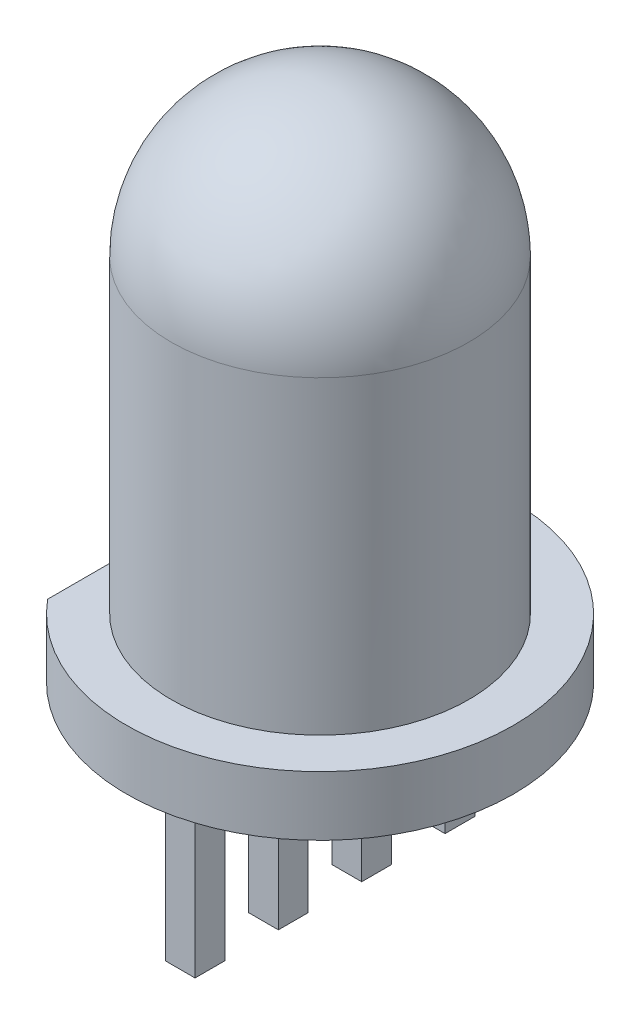
ISO-10303-21;
HEADER;
FILE_DESCRIPTION(('STEP AP214'),'2;1');
FILE_NAME('part.step','',(''),(''),'','','');
FILE_SCHEMA(('AUTOMOTIVE_DESIGN { 1 0 10303 214 1 1 1 1 }'));
ENDSEC;
DATA;
#1=APPLICATION_CONTEXT('core data for automotive mechanical design processes');
#2=APPLICATION_PROTOCOL_DEFINITION('international standard','automotive_design',2000,#1);
#3=PRODUCT_CONTEXT('',#1,'mechanical');
#4=PRODUCT('Part','Part','',(#3));
#5=PRODUCT_RELATED_PRODUCT_CATEGORY('part','',(#4));
#6=PRODUCT_DEFINITION_FORMATION('','',#4);
#7=PRODUCT_DEFINITION_CONTEXT('part definition',#1,'design');
#8=PRODUCT_DEFINITION('design','',#6,#7);
#9=PRODUCT_DEFINITION_SHAPE('','',#8);
#10=(LENGTH_UNIT() NAMED_UNIT(*) SI_UNIT(.MILLI.,.METRE.));
#11=(NAMED_UNIT(*) PLANE_ANGLE_UNIT() SI_UNIT($,.RADIAN.));
#12=(NAMED_UNIT(*) SI_UNIT($,.STERADIAN.) SOLID_ANGLE_UNIT());
#13=UNCERTAINTY_MEASURE_WITH_UNIT(LENGTH_MEASURE(1.E-05),#10,'distance_accuracy_value','');
#14=(GEOMETRIC_REPRESENTATION_CONTEXT(3) GLOBAL_UNCERTAINTY_ASSIGNED_CONTEXT((#13)) GLOBAL_UNIT_ASSIGNED_CONTEXT((#10,
#11,#12)) REPRESENTATION_CONTEXT('',''));
#15=CARTESIAN_POINT('',(0.,0.,0.));
#16=DIRECTION('',(0.,0.,1.));
#17=DIRECTION('',(1.,0.,0.));
#18=AXIS2_PLACEMENT_3D('',#15,#16,#17);
#19=CARTESIAN_POINT('',(0.,0.,0.));
#20=DIRECTION('',(0.,1.,0.));
#21=DIRECTION('',(0.,0.,1.));
#22=AXIS2_PLACEMENT_3D('',#19,#20,#21);
#23=PLANE('',#22);
#24=DIRECTION('',(-1.,0.,0.));
#25=VECTOR('',#24,1.);
#26=CARTESIAN_POINT('',(-0.249999999999971,0.,-0.45));
#27=LINE('',#26,#25);
#28=CARTESIAN_POINT('',(0.250000000000029,0.,-0.45));
#29=VERTEX_POINT('',#28);
#30=CARTESIAN_POINT('',(-0.249999999999971,0.,-0.45));
#31=VERTEX_POINT('',#30);
#32=EDGE_CURVE('E184',#29,#31,#27,.T.);
#33=ORIENTED_EDGE('',*,*,#32,.F.);
#34=DIRECTION('',(0.,0.,1.));
#35=VECTOR('',#34,1.);
#36=CARTESIAN_POINT('',(0.250000000000029,0.,-0.45));
#37=LINE('',#36,#35);
#38=CARTESIAN_POINT('',(0.250000000000029,0.,-0.95));
#39=VERTEX_POINT('',#38);
#40=EDGE_CURVE('E197',#39,#29,#37,.T.);
#41=ORIENTED_EDGE('',*,*,#40,.F.);
#42=DIRECTION('',(1.,0.,0.));
#43=VECTOR('',#42,1.);
#44=CARTESIAN_POINT('',(-0.249999999999971,0.,-0.95));
#45=LINE('',#44,#43);
#46=CARTESIAN_POINT('',(-0.249999999999971,0.,-0.95));
#47=VERTEX_POINT('',#46);
#48=EDGE_CURVE('E206',#47,#39,#45,.T.);
#49=ORIENTED_EDGE('',*,*,#48,.F.);
#50=DIRECTION('',(0.,0.,-1.));
#51=VECTOR('',#50,1.);
#52=CARTESIAN_POINT('',(-0.249999999999971,0.,-0.45));
#53=LINE('',#52,#51);
#54=EDGE_CURVE('E187',#31,#47,#53,.T.);
#55=ORIENTED_EDGE('',*,*,#54,.F.);
#56=EDGE_LOOP('',(#33,#41,#49,#55));
#57=FACE_BOUND('',#56,.T.);
#58=DIRECTION('',(0.,0.,-1.));
#59=VECTOR('',#58,1.);
#60=CARTESIAN_POINT('',(-0.25,0.,2.35));
#61=LINE('',#60,#59);
#62=CARTESIAN_POINT('',(-0.25,0.,2.35));
#63=VERTEX_POINT('',#62);
#64=CARTESIAN_POINT('',(-0.25,0.,1.85));
#65=VERTEX_POINT('',#64);
#66=EDGE_CURVE('E255',#63,#65,#61,.T.);
#67=ORIENTED_EDGE('',*,*,#66,.F.);
#68=DIRECTION('',(-1.,0.,0.));
#69=VECTOR('',#68,1.);
#70=CARTESIAN_POINT('',(-0.25,0.,2.35));
#71=LINE('',#70,#69);
#72=CARTESIAN_POINT('',(0.25,0.,2.35));
#73=VERTEX_POINT('',#72);
#74=EDGE_CURVE('E260',#73,#63,#71,.T.);
#75=ORIENTED_EDGE('',*,*,#74,.F.);
#76=DIRECTION('',(0.,0.,1.));
#77=VECTOR('',#76,1.);
#78=CARTESIAN_POINT('',(0.25,0.,2.35));
#79=LINE('',#78,#77);
#80=CARTESIAN_POINT('',(0.25,0.,1.85));
#81=VERTEX_POINT('',#80);
#82=EDGE_CURVE('E272',#81,#73,#79,.T.);
#83=ORIENTED_EDGE('',*,*,#82,.F.);
#84=DIRECTION('',(1.,0.,0.));
#85=VECTOR('',#84,1.);
#86=CARTESIAN_POINT('',(-0.25,0.,1.85));
#87=LINE('',#86,#85);
#88=EDGE_CURVE('E269',#65,#81,#87,.T.);
#89=ORIENTED_EDGE('',*,*,#88,.F.);
#90=EDGE_LOOP('',(#67,#75,#83,#89));
#91=FACE_BOUND('',#90,.T.);
#92=CARTESIAN_POINT('',(0.,0.,0.));
#93=DIRECTION('',(0.,-1.,0.));
#94=DIRECTION('',(0.,0.,-1.));
#95=AXIS2_PLACEMENT_3D('',#92,#93,#94);
#96=CIRCLE('',#95,3.25);
#97=CARTESIAN_POINT('',(-2.5,0.,-2.07665596572952));
#98=VERTEX_POINT('',#97);
#99=CARTESIAN_POINT('',(-2.5,0.,2.07665596572952));
#100=VERTEX_POINT('',#99);
#101=EDGE_CURVE('E298',#98,#100,#96,.T.);
#102=ORIENTED_EDGE('',*,*,#101,.T.);
#103=DIRECTION('',(0.,0.,1.));
#104=VECTOR('',#103,1.);
#105=CARTESIAN_POINT('',(-2.5,0.,-2.07665596572952));
#106=LINE('',#105,#104);
#107=EDGE_CURVE('E295',#98,#100,#106,.T.);
#108=ORIENTED_EDGE('',*,*,#107,.F.);
#109=EDGE_LOOP('',(#102,#108));
#110=FACE_BOUND('',#109,.T.);
#111=DIRECTION('',(-1.,0.,0.));
#112=VECTOR('',#111,1.);
#113=CARTESIAN_POINT('',(-0.249999999999985,0.,0.95));
#114=LINE('',#113,#112);
#115=CARTESIAN_POINT('',(0.250000000000015,0.,0.95));
#116=VERTEX_POINT('',#115);
#117=CARTESIAN_POINT('',(-0.249999999999985,0.,0.95));
#118=VERTEX_POINT('',#117);
#119=EDGE_CURVE('E222',#116,#118,#114,.T.);
#120=ORIENTED_EDGE('',*,*,#119,.F.);
#121=DIRECTION('',(0.,0.,1.));
#122=VECTOR('',#121,1.);
#123=CARTESIAN_POINT('',(0.250000000000015,0.,0.95));
#124=LINE('',#123,#122);
#125=CARTESIAN_POINT('',(0.250000000000015,0.,0.45));
#126=VERTEX_POINT('',#125);
#127=EDGE_CURVE('E227',#126,#116,#124,.T.);
#128=ORIENTED_EDGE('',*,*,#127,.F.);
#129=DIRECTION('',(1.,0.,0.));
#130=VECTOR('',#129,1.);
#131=CARTESIAN_POINT('',(-0.249999999999985,0.,0.45));
#132=LINE('',#131,#130);
#133=CARTESIAN_POINT('',(-0.249999999999985,0.,0.45));
#134=VERTEX_POINT('',#133);
#135=EDGE_CURVE('E239',#134,#126,#132,.T.);
#136=ORIENTED_EDGE('',*,*,#135,.F.);
#137=DIRECTION('',(0.,0.,-1.));
#138=VECTOR('',#137,1.);
#139=CARTESIAN_POINT('',(-0.249999999999985,0.,0.95));
#140=LINE('',#139,#138);
#141=EDGE_CURVE('E236',#118,#134,#140,.T.);
#142=ORIENTED_EDGE('',*,*,#141,.F.);
#143=EDGE_LOOP('',(#120,#128,#136,#142));
#144=FACE_BOUND('',#143,.T.);
#145=DIRECTION('',(-1.,0.,0.));
#146=VECTOR('',#145,1.);
#147=CARTESIAN_POINT('',(-0.249999999999956,0.,-1.85));
#148=LINE('',#147,#146);
#149=CARTESIAN_POINT('',(0.250000000000044,0.,-1.85));
#150=VERTEX_POINT('',#149);
#151=CARTESIAN_POINT('',(-0.249999999999956,0.,-1.85));
#152=VERTEX_POINT('',#151);
#153=EDGE_CURVE('E183',#150,#152,#148,.T.);
#154=ORIENTED_EDGE('',*,*,#153,.F.);
#155=DIRECTION('',(0.,0.,1.));
#156=VECTOR('',#155,1.);
#157=CARTESIAN_POINT('',(0.250000000000044,0.,-1.85));
#158=LINE('',#157,#156);
#159=CARTESIAN_POINT('',(0.250000000000044,0.,-2.35));
#160=VERTEX_POINT('',#159);
#161=EDGE_CURVE('E180',#160,#150,#158,.T.);
#162=ORIENTED_EDGE('',*,*,#161,.F.);
#163=DIRECTION('',(1.,0.,0.));
#164=VECTOR('',#163,1.);
#165=CARTESIAN_POINT('',(-0.249999999999956,0.,-2.35));
#166=LINE('',#165,#164);
#167=CARTESIAN_POINT('',(-0.249999999999956,0.,-2.35));
#168=VERTEX_POINT('',#167);
#169=EDGE_CURVE('E55',#168,#160,#166,.T.);
#170=ORIENTED_EDGE('',*,*,#169,.F.);
#171=DIRECTION('',(0.,0.,-1.));
#172=VECTOR('',#171,1.);
#173=CARTESIAN_POINT('',(-0.249999999999956,0.,-1.85));
#174=LINE('',#173,#172);
#175=EDGE_CURVE('E50',#152,#168,#174,.T.);
#176=ORIENTED_EDGE('',*,*,#175,.F.);
#177=EDGE_LOOP('',(#154,#162,#170,#176));
#178=FACE_BOUND('',#177,.T.);
#179=ADVANCED_FACE('F35',(#57,#91,#110,#144,#178),#23,.F.);
#180=CARTESIAN_POINT('',(0.,6.2,0.));
#181=DIRECTION('',(0.,-1.,0.));
#182=DIRECTION('',(0.,0.,1.));
#183=AXIS2_PLACEMENT_3D('',#180,#181,#182);
#184=SPHERICAL_SURFACE('',#183,2.5);
#185=CARTESIAN_POINT('',(0.,6.2,0.));
#186=DIRECTION('',(0.,-1.,0.));
#187=DIRECTION('',(0.,0.,-1.));
#188=AXIS2_PLACEMENT_3D('',#185,#186,#187);
#189=CIRCLE('',#188,2.5);
#190=CARTESIAN_POINT('',(0.,6.2,-2.5));
#191=VERTEX_POINT('',#190);
#192=EDGE_CURVE('E11',#191,#191,#189,.T.);
#193=ORIENTED_EDGE('',*,*,#192,.F.);
#194=EDGE_LOOP('',(#193));
#195=FACE_BOUND('',#194,.T.);
#196=ADVANCED_FACE('F37',(#195),#184,.T.);
#197=CARTESIAN_POINT('',(0.,-2.60330162387972,0.));
#198=DIRECTION('',(0.,-1.,0.));
#199=DIRECTION('',(0.,0.,-1.));
#200=AXIS2_PLACEMENT_3D('',#197,#198,#199);
#201=CYLINDRICAL_SURFACE('',#200,2.5);
#202=ORIENTED_EDGE('',*,*,#192,.T.);
#203=EDGE_LOOP('',(#202));
#204=FACE_BOUND('',#203,.T.);
#205=CARTESIAN_POINT('',(0.,1.,0.));
#206=DIRECTION('',(0.,-1.,0.));
#207=DIRECTION('',(0.,0.,-1.));
#208=AXIS2_PLACEMENT_3D('',#205,#206,#207);
#209=CIRCLE('',#208,2.5);
#210=CARTESIAN_POINT('',(-2.5,1.,0.));
#211=VERTEX_POINT('',#210);
#212=EDGE_CURVE('E43',#211,#211,#209,.T.);
#213=ORIENTED_EDGE('',*,*,#212,.F.);
#214=EDGE_LOOP('',(#213));
#215=FACE_BOUND('',#214,.T.);
#216=ADVANCED_FACE('F311',(#204,#215),#201,.T.);
#217=CARTESIAN_POINT('',(0.,1.,0.));
#218=DIRECTION('',(0.,1.,0.));
#219=DIRECTION('',(0.,0.,1.));
#220=AXIS2_PLACEMENT_3D('',#217,#218,#219);
#221=PLANE('',#220);
#222=DIRECTION('',(0.,0.,-1.));
#223=VECTOR('',#222,1.);
#224=CARTESIAN_POINT('',(-2.5,1.,-2.07665596572952));
#225=LINE('',#224,#223);
#226=CARTESIAN_POINT('',(-2.5,1.,2.07665596572952));
#227=VERTEX_POINT('',#226);
#228=EDGE_CURVE('E289',#227,#211,#225,.T.);
#229=ORIENTED_EDGE('',*,*,#228,.F.);
#230=CARTESIAN_POINT('',(0.,1.,0.));
#231=DIRECTION('',(0.,-1.,0.));
#232=DIRECTION('',(0.,0.,-1.));
#233=AXIS2_PLACEMENT_3D('',#230,#231,#232);
#234=CIRCLE('',#233,3.25);
#235=CARTESIAN_POINT('',(-2.5,1.,-2.07665596572952));
#236=VERTEX_POINT('',#235);
#237=EDGE_CURVE('E301',#236,#227,#234,.T.);
#238=ORIENTED_EDGE('',*,*,#237,.F.);
#239=EDGE_CURVE('E288',#211,#236,#225,.T.);
#240=ORIENTED_EDGE('',*,*,#239,.F.);
#241=ORIENTED_EDGE('',*,*,#212,.T.);
#242=EDGE_LOOP('',(#229,#238,#240,#241));
#243=FACE_BOUND('',#242,.T.);
#244=ADVANCED_FACE('F308',(#243),#221,.T.);
#245=CARTESIAN_POINT('',(0.,-2.60330162387972,0.));
#246=DIRECTION('',(0.,-1.,0.));
#247=DIRECTION('',(0.,0.,-1.));
#248=AXIS2_PLACEMENT_3D('',#245,#246,#247);
#249=CYLINDRICAL_SURFACE('',#248,3.25);
#250=DIRECTION('',(0.,1.,0.));
#251=VECTOR('',#250,1.);
#252=CARTESIAN_POINT('',(-2.5,-0.000999999999999916,2.07665596572952));
#253=LINE('',#252,#251);
#254=EDGE_CURVE('E291',#100,#227,#253,.T.);
#255=ORIENTED_EDGE('',*,*,#254,.F.);
#256=ORIENTED_EDGE('',*,*,#101,.F.);
#257=DIRECTION('',(0.,1.,0.));
#258=VECTOR('',#257,1.);
#259=CARTESIAN_POINT('',(-2.5,-0.000999999999999916,-2.07665596572952));
#260=LINE('',#259,#258);
#261=EDGE_CURVE('E292',#98,#236,#260,.T.);
#262=ORIENTED_EDGE('',*,*,#261,.T.);
#263=ORIENTED_EDGE('',*,*,#237,.T.);
#264=EDGE_LOOP('',(#255,#256,#262,#263));
#265=FACE_BOUND('',#264,.T.);
#266=ADVANCED_FACE('F318',(#265),#249,.T.);
#267=CARTESIAN_POINT('',(-2.5,-0.000999999999999916,-2.07665596572952));
#268=DIRECTION('',(1.,0.,0.));
#269=DIRECTION('',(0.,0.,-1.));
#270=AXIS2_PLACEMENT_3D('',#267,#268,#269);
#271=PLANE('',#270);
#272=ORIENTED_EDGE('',*,*,#107,.T.);
#273=ORIENTED_EDGE('',*,*,#254,.T.);
#274=ORIENTED_EDGE('',*,*,#228,.T.);
#275=ORIENTED_EDGE('',*,*,#239,.T.);
#276=ORIENTED_EDGE('',*,*,#261,.F.);
#277=EDGE_LOOP('',(#272,#273,#274,#275,#276));
#278=FACE_BOUND('',#277,.T.);
#279=ADVANCED_FACE('F329',(#278),#271,.F.);
#280=CARTESIAN_POINT('',(-0.25,-3.,2.35));
#281=DIRECTION('',(1.,0.,0.));
#282=DIRECTION('',(0.,0.,-1.));
#283=AXIS2_PLACEMENT_3D('',#280,#281,#282);
#284=PLANE('',#283);
#285=ORIENTED_EDGE('',*,*,#66,.T.);
#286=DIRECTION('',(0.,1.,0.));
#287=VECTOR('',#286,1.);
#288=CARTESIAN_POINT('',(-0.25,-3.,1.85));
#289=LINE('',#288,#287);
#290=CARTESIAN_POINT('',(-0.25,-3.,1.85));
#291=VERTEX_POINT('',#290);
#292=EDGE_CURVE('E285',#291,#65,#289,.T.);
#293=ORIENTED_EDGE('',*,*,#292,.F.);
#294=DIRECTION('',(0.,0.,-1.));
#295=VECTOR('',#294,1.);
#296=CARTESIAN_POINT('',(-0.25,-3.,2.35));
#297=LINE('',#296,#295);
#298=CARTESIAN_POINT('',(-0.25,-3.,2.35));
#299=VERTEX_POINT('',#298);
#300=EDGE_CURVE('E256',#299,#291,#297,.T.);
#301=ORIENTED_EDGE('',*,*,#300,.F.);
#302=DIRECTION('',(0.,1.,0.));
#303=VECTOR('',#302,1.);
#304=CARTESIAN_POINT('',(-0.25,-3.,2.35));
#305=LINE('',#304,#303);
#306=EDGE_CURVE('E266',#299,#63,#305,.T.);
#307=ORIENTED_EDGE('',*,*,#306,.T.);
#308=EDGE_LOOP('',(#285,#293,#301,#307));
#309=FACE_BOUND('',#308,.T.);
#310=ADVANCED_FACE('F336',(#309),#284,.F.);
#311=CARTESIAN_POINT('',(-0.25,-3.,1.85));
#312=DIRECTION('',(0.,0.,1.));
#313=DIRECTION('',(1.,0.,0.));
#314=AXIS2_PLACEMENT_3D('',#311,#312,#313);
#315=PLANE('',#314);
#316=ORIENTED_EDGE('',*,*,#88,.T.);
#317=DIRECTION('',(0.,1.,0.));
#318=VECTOR('',#317,1.);
#319=CARTESIAN_POINT('',(0.25,-3.,1.85));
#320=LINE('',#319,#318);
#321=CARTESIAN_POINT('',(0.25,-3.,1.85));
#322=VERTEX_POINT('',#321);
#323=EDGE_CURVE('E282',#322,#81,#320,.T.);
#324=ORIENTED_EDGE('',*,*,#323,.F.);
#325=DIRECTION('',(1.,0.,0.));
#326=VECTOR('',#325,1.);
#327=CARTESIAN_POINT('',(-0.25,-3.,1.85));
#328=LINE('',#327,#326);
#329=EDGE_CURVE('E259',#291,#322,#328,.T.);
#330=ORIENTED_EDGE('',*,*,#329,.F.);
#331=ORIENTED_EDGE('',*,*,#292,.T.);
#332=EDGE_LOOP('',(#316,#324,#330,#331));
#333=FACE_BOUND('',#332,.T.);
#334=ADVANCED_FACE('F421',(#333),#315,.F.);
#335=CARTESIAN_POINT('',(0.25,-3.,2.35));
#336=DIRECTION('',(-1.,0.,0.));
#337=DIRECTION('',(0.,0.,1.));
#338=AXIS2_PLACEMENT_3D('',#335,#336,#337);
#339=PLANE('',#338);
#340=ORIENTED_EDGE('',*,*,#82,.T.);
#341=DIRECTION('',(0.,1.,0.));
#342=VECTOR('',#341,1.);
#343=CARTESIAN_POINT('',(0.25,-3.,2.35));
#344=LINE('',#343,#342);
#345=CARTESIAN_POINT('',(0.25,-3.,2.35));
#346=VERTEX_POINT('',#345);
#347=EDGE_CURVE('E279',#346,#73,#344,.T.);
#348=ORIENTED_EDGE('',*,*,#347,.F.);
#349=DIRECTION('',(0.,0.,1.));
#350=VECTOR('',#349,1.);
#351=CARTESIAN_POINT('',(0.25,-3.,2.35));
#352=LINE('',#351,#350);
#353=EDGE_CURVE('E262',#322,#346,#352,.T.);
#354=ORIENTED_EDGE('',*,*,#353,.F.);
#355=ORIENTED_EDGE('',*,*,#323,.T.);
#356=EDGE_LOOP('',(#340,#348,#354,#355));
#357=FACE_BOUND('',#356,.T.);
#358=ADVANCED_FACE('F417',(#357),#339,.F.);
#359=CARTESIAN_POINT('',(-0.25,-3.,2.35));
#360=DIRECTION('',(0.,0.,-1.));
#361=DIRECTION('',(-1.,0.,0.));
#362=AXIS2_PLACEMENT_3D('',#359,#360,#361);
#363=PLANE('',#362);
#364=ORIENTED_EDGE('',*,*,#74,.T.);
#365=ORIENTED_EDGE('',*,*,#306,.F.);
#366=DIRECTION('',(-1.,0.,0.));
#367=VECTOR('',#366,1.);
#368=CARTESIAN_POINT('',(-0.25,-3.,2.35));
#369=LINE('',#368,#367);
#370=EDGE_CURVE('E264',#346,#299,#369,.T.);
#371=ORIENTED_EDGE('',*,*,#370,.F.);
#372=ORIENTED_EDGE('',*,*,#347,.T.);
#373=EDGE_LOOP('',(#364,#365,#371,#372));
#374=FACE_BOUND('',#373,.T.);
#375=ADVANCED_FACE('F413',(#374),#363,.F.);
#376=CARTESIAN_POINT('',(0.,-3.,0.));
#377=DIRECTION('',(0.,-1.,0.));
#378=DIRECTION('',(0.,0.,-1.));
#379=AXIS2_PLACEMENT_3D('',#376,#377,#378);
#380=PLANE('',#379);
#381=ORIENTED_EDGE('',*,*,#300,.T.);
#382=ORIENTED_EDGE('',*,*,#329,.T.);
#383=ORIENTED_EDGE('',*,*,#353,.T.);
#384=ORIENTED_EDGE('',*,*,#370,.T.);
#385=EDGE_LOOP('',(#381,#382,#383,#384));
#386=FACE_BOUND('',#385,.T.);
#387=ADVANCED_FACE('F409',(#386),#380,.T.);
#388=CARTESIAN_POINT('',(-0.249999999999985,-3.,0.95));
#389=DIRECTION('',(0.,0.,-1.));
#390=DIRECTION('',(-1.,0.,0.));
#391=AXIS2_PLACEMENT_3D('',#388,#389,#390);
#392=PLANE('',#391);
#393=ORIENTED_EDGE('',*,*,#119,.T.);
#394=DIRECTION('',(0.,1.,0.));
#395=VECTOR('',#394,1.);
#396=CARTESIAN_POINT('',(-0.249999999999985,-3.,0.95));
#397=LINE('',#396,#395);
#398=CARTESIAN_POINT('',(-0.249999999999985,-3.,0.95));
#399=VERTEX_POINT('',#398);
#400=EDGE_CURVE('E252',#399,#118,#397,.T.);
#401=ORIENTED_EDGE('',*,*,#400,.F.);
#402=DIRECTION('',(-1.,0.,0.));
#403=VECTOR('',#402,1.);
#404=CARTESIAN_POINT('',(-0.249999999999985,-3.,0.95));
#405=LINE('',#404,#403);
#406=CARTESIAN_POINT('',(0.250000000000015,-3.,0.95));
#407=VERTEX_POINT('',#406);
#408=EDGE_CURVE('E223',#407,#399,#405,.T.);
#409=ORIENTED_EDGE('',*,*,#408,.F.);
#410=DIRECTION('',(0.,1.,0.));
#411=VECTOR('',#410,1.);
#412=CARTESIAN_POINT('',(0.250000000000015,-3.,0.95));
#413=LINE('',#412,#411);
#414=EDGE_CURVE('E233',#407,#116,#413,.T.);
#415=ORIENTED_EDGE('',*,*,#414,.T.);
#416=EDGE_LOOP('',(#393,#401,#409,#415));
#417=FACE_BOUND('',#416,.T.);
#418=ADVANCED_FACE('F405',(#417),#392,.F.);
#419=CARTESIAN_POINT('',(-0.249999999999985,-3.,0.95));
#420=DIRECTION('',(1.,0.,0.));
#421=DIRECTION('',(0.,0.,-1.));
#422=AXIS2_PLACEMENT_3D('',#419,#420,#421);
#423=PLANE('',#422);
#424=ORIENTED_EDGE('',*,*,#141,.T.);
#425=DIRECTION('',(0.,1.,0.));
#426=VECTOR('',#425,1.);
#427=CARTESIAN_POINT('',(-0.249999999999985,-3.,0.45));
#428=LINE('',#427,#426);
#429=CARTESIAN_POINT('',(-0.249999999999985,-3.,0.45));
#430=VERTEX_POINT('',#429);
#431=EDGE_CURVE('E249',#430,#134,#428,.T.);
#432=ORIENTED_EDGE('',*,*,#431,.F.);
#433=DIRECTION('',(0.,0.,-1.));
#434=VECTOR('',#433,1.);
#435=CARTESIAN_POINT('',(-0.249999999999985,-3.,0.95));
#436=LINE('',#435,#434);
#437=EDGE_CURVE('E226',#399,#430,#436,.T.);
#438=ORIENTED_EDGE('',*,*,#437,.F.);
#439=ORIENTED_EDGE('',*,*,#400,.T.);
#440=EDGE_LOOP('',(#424,#432,#438,#439));
#441=FACE_BOUND('',#440,.T.);
#442=ADVANCED_FACE('F401',(#441),#423,.F.);
#443=CARTESIAN_POINT('',(-0.249999999999985,-3.,0.45));
#444=DIRECTION('',(0.,0.,1.));
#445=DIRECTION('',(1.,0.,0.));
#446=AXIS2_PLACEMENT_3D('',#443,#444,#445);
#447=PLANE('',#446);
#448=ORIENTED_EDGE('',*,*,#135,.T.);
#449=DIRECTION('',(0.,1.,0.));
#450=VECTOR('',#449,1.);
#451=CARTESIAN_POINT('',(0.250000000000015,-3.,0.45));
#452=LINE('',#451,#450);
#453=CARTESIAN_POINT('',(0.250000000000015,-3.,0.45));
#454=VERTEX_POINT('',#453);
#455=EDGE_CURVE('E246',#454,#126,#452,.T.);
#456=ORIENTED_EDGE('',*,*,#455,.F.);
#457=DIRECTION('',(1.,0.,0.));
#458=VECTOR('',#457,1.);
#459=CARTESIAN_POINT('',(-0.249999999999985,-3.,0.45));
#460=LINE('',#459,#458);
#461=EDGE_CURVE('E229',#430,#454,#460,.T.);
#462=ORIENTED_EDGE('',*,*,#461,.F.);
#463=ORIENTED_EDGE('',*,*,#431,.T.);
#464=EDGE_LOOP('',(#448,#456,#462,#463));
#465=FACE_BOUND('',#464,.T.);
#466=ADVANCED_FACE('F397',(#465),#447,.F.);
#467=CARTESIAN_POINT('',(0.250000000000015,-3.,0.95));
#468=DIRECTION('',(-1.,0.,0.));
#469=DIRECTION('',(0.,0.,1.));
#470=AXIS2_PLACEMENT_3D('',#467,#468,#469);
#471=PLANE('',#470);
#472=ORIENTED_EDGE('',*,*,#127,.T.);
#473=ORIENTED_EDGE('',*,*,#414,.F.);
#474=DIRECTION('',(0.,0.,1.));
#475=VECTOR('',#474,1.);
#476=CARTESIAN_POINT('',(0.250000000000015,-3.,0.95));
#477=LINE('',#476,#475);
#478=EDGE_CURVE('E231',#454,#407,#477,.T.);
#479=ORIENTED_EDGE('',*,*,#478,.F.);
#480=ORIENTED_EDGE('',*,*,#455,.T.);
#481=EDGE_LOOP('',(#472,#473,#479,#480));
#482=FACE_BOUND('',#481,.T.);
#483=ADVANCED_FACE('F393',(#482),#471,.F.);
#484=CARTESIAN_POINT('',(0.,-3.,0.));
#485=DIRECTION('',(0.,1.,0.));
#486=DIRECTION('',(0.,0.,1.));
#487=AXIS2_PLACEMENT_3D('',#484,#485,#486);
#488=PLANE('',#487);
#489=ORIENTED_EDGE('',*,*,#408,.T.);
#490=ORIENTED_EDGE('',*,*,#437,.T.);
#491=ORIENTED_EDGE('',*,*,#461,.T.);
#492=ORIENTED_EDGE('',*,*,#478,.T.);
#493=EDGE_LOOP('',(#489,#490,#491,#492));
#494=FACE_BOUND('',#493,.T.);
#495=ADVANCED_FACE('F389',(#494),#488,.F.);
#496=CARTESIAN_POINT('',(-0.249999999999971,-3.,-0.45));
#497=DIRECTION('',(0.,0.,-1.));
#498=DIRECTION('',(-1.,0.,0.));
#499=AXIS2_PLACEMENT_3D('',#496,#497,#498);
#500=PLANE('',#499);
#501=ORIENTED_EDGE('',*,*,#32,.T.);
#502=DIRECTION('',(0.,1.,0.));
#503=VECTOR('',#502,1.);
#504=CARTESIAN_POINT('',(-0.249999999999971,-3.,-0.45));
#505=LINE('',#504,#503);
#506=CARTESIAN_POINT('',(-0.249999999999971,-3.,-0.45));
#507=VERTEX_POINT('',#506);
#508=EDGE_CURVE('E219',#507,#31,#505,.T.);
#509=ORIENTED_EDGE('',*,*,#508,.F.);
#510=DIRECTION('',(-1.,0.,0.));
#511=VECTOR('',#510,1.);
#512=CARTESIAN_POINT('',(-0.249999999999971,-3.,-0.45));
#513=LINE('',#512,#511);
#514=CARTESIAN_POINT('',(0.250000000000029,-3.,-0.45));
#515=VERTEX_POINT('',#514);
#516=EDGE_CURVE('E193',#515,#507,#513,.T.);
#517=ORIENTED_EDGE('',*,*,#516,.F.);
#518=DIRECTION('',(0.,1.,0.));
#519=VECTOR('',#518,1.);
#520=CARTESIAN_POINT('',(0.250000000000029,-3.,-0.45));
#521=LINE('',#520,#519);
#522=EDGE_CURVE('E202',#515,#29,#521,.T.);
#523=ORIENTED_EDGE('',*,*,#522,.T.);
#524=EDGE_LOOP('',(#501,#509,#517,#523));
#525=FACE_BOUND('',#524,.T.);
#526=ADVANCED_FACE('F385',(#525),#500,.F.);
#527=CARTESIAN_POINT('',(-0.249999999999971,-3.,-0.45));
#528=DIRECTION('',(1.,0.,0.));
#529=DIRECTION('',(0.,0.,-1.));
#530=AXIS2_PLACEMENT_3D('',#527,#528,#529);
#531=PLANE('',#530);
#532=ORIENTED_EDGE('',*,*,#54,.T.);
#533=DIRECTION('',(0.,1.,0.));
#534=VECTOR('',#533,1.);
#535=CARTESIAN_POINT('',(-0.249999999999971,-3.,-0.95));
#536=LINE('',#535,#534);
#537=CARTESIAN_POINT('',(-0.249999999999971,-3.,-0.95));
#538=VERTEX_POINT('',#537);
#539=EDGE_CURVE('E216',#538,#47,#536,.T.);
#540=ORIENTED_EDGE('',*,*,#539,.F.);
#541=DIRECTION('',(0.,0.,-1.));
#542=VECTOR('',#541,1.);
#543=CARTESIAN_POINT('',(-0.249999999999971,-3.,-0.45));
#544=LINE('',#543,#542);
#545=EDGE_CURVE('E196',#507,#538,#544,.T.);
#546=ORIENTED_EDGE('',*,*,#545,.F.);
#547=ORIENTED_EDGE('',*,*,#508,.T.);
#548=EDGE_LOOP('',(#532,#540,#546,#547));
#549=FACE_BOUND('',#548,.T.);
#550=ADVANCED_FACE('F381',(#549),#531,.F.);
#551=CARTESIAN_POINT('',(-0.249999999999971,-3.,-0.95));
#552=DIRECTION('',(0.,0.,1.));
#553=DIRECTION('',(1.,0.,0.));
#554=AXIS2_PLACEMENT_3D('',#551,#552,#553);
#555=PLANE('',#554);
#556=ORIENTED_EDGE('',*,*,#48,.T.);
#557=DIRECTION('',(0.,1.,0.));
#558=VECTOR('',#557,1.);
#559=CARTESIAN_POINT('',(0.250000000000029,-3.,-0.95));
#560=LINE('',#559,#558);
#561=CARTESIAN_POINT('',(0.250000000000029,-3.,-0.95));
#562=VERTEX_POINT('',#561);
#563=EDGE_CURVE('E213',#562,#39,#560,.T.);
#564=ORIENTED_EDGE('',*,*,#563,.F.);
#565=DIRECTION('',(1.,0.,0.));
#566=VECTOR('',#565,1.);
#567=CARTESIAN_POINT('',(-0.249999999999971,-3.,-0.95));
#568=LINE('',#567,#566);
#569=EDGE_CURVE('E199',#538,#562,#568,.T.);
#570=ORIENTED_EDGE('',*,*,#569,.F.);
#571=ORIENTED_EDGE('',*,*,#539,.T.);
#572=EDGE_LOOP('',(#556,#564,#570,#571));
#573=FACE_BOUND('',#572,.T.);
#574=ADVANCED_FACE('F377',(#573),#555,.F.);
#575=CARTESIAN_POINT('',(0.250000000000029,-3.,-0.45));
#576=DIRECTION('',(-1.,0.,0.));
#577=DIRECTION('',(0.,0.,1.));
#578=AXIS2_PLACEMENT_3D('',#575,#576,#577);
#579=PLANE('',#578);
#580=ORIENTED_EDGE('',*,*,#40,.T.);
#581=ORIENTED_EDGE('',*,*,#522,.F.);
#582=DIRECTION('',(0.,0.,1.));
#583=VECTOR('',#582,1.);
#584=CARTESIAN_POINT('',(0.250000000000029,-3.,-0.45));
#585=LINE('',#584,#583);
#586=EDGE_CURVE('E201',#562,#515,#585,.T.);
#587=ORIENTED_EDGE('',*,*,#586,.F.);
#588=ORIENTED_EDGE('',*,*,#563,.T.);
#589=EDGE_LOOP('',(#580,#581,#587,#588));
#590=FACE_BOUND('',#589,.T.);
#591=ADVANCED_FACE('F373',(#590),#579,.F.);
#592=CARTESIAN_POINT('',(0.,-3.,0.));
#593=DIRECTION('',(0.,1.,0.));
#594=DIRECTION('',(0.,0.,1.));
#595=AXIS2_PLACEMENT_3D('',#592,#593,#594);
#596=PLANE('',#595);
#597=ORIENTED_EDGE('',*,*,#516,.T.);
#598=ORIENTED_EDGE('',*,*,#545,.T.);
#599=ORIENTED_EDGE('',*,*,#569,.T.);
#600=ORIENTED_EDGE('',*,*,#586,.T.);
#601=EDGE_LOOP('',(#597,#598,#599,#600));
#602=FACE_BOUND('',#601,.T.);
#603=ADVANCED_FACE('F370',(#602),#596,.F.);
#604=CARTESIAN_POINT('',(-0.249999999999956,-3.,-1.85));
#605=DIRECTION('',(0.,0.,-1.));
#606=DIRECTION('',(-1.,0.,0.));
#607=AXIS2_PLACEMENT_3D('',#604,#605,#606);
#608=PLANE('',#607);
#609=ORIENTED_EDGE('',*,*,#153,.T.);
#610=DIRECTION('',(0.,1.,0.));
#611=VECTOR('',#610,1.);
#612=CARTESIAN_POINT('',(-0.249999999999956,-3.,-1.85));
#613=LINE('',#612,#611);
#614=CARTESIAN_POINT('',(-0.249999999999956,-3.,-1.85));
#615=VERTEX_POINT('',#614);
#616=EDGE_CURVE('E164',#615,#152,#613,.T.);
#617=ORIENTED_EDGE('',*,*,#616,.F.);
#618=DIRECTION('',(-1.,0.,0.));
#619=VECTOR('',#618,1.);
#620=CARTESIAN_POINT('',(-0.249999999999956,-3.,-1.85));
#621=LINE('',#620,#619);
#622=CARTESIAN_POINT('',(0.250000000000044,-3.,-1.85));
#623=VERTEX_POINT('',#622);
#624=EDGE_CURVE('E171',#623,#615,#621,.T.);
#625=ORIENTED_EDGE('',*,*,#624,.F.);
#626=DIRECTION('',(0.,1.,0.));
#627=VECTOR('',#626,1.);
#628=CARTESIAN_POINT('',(0.250000000000044,-3.,-1.85));
#629=LINE('',#628,#627);
#630=EDGE_CURVE('E348',#623,#150,#629,.T.);
#631=ORIENTED_EDGE('',*,*,#630,.T.);
#632=EDGE_LOOP('',(#609,#617,#625,#631));
#633=FACE_BOUND('',#632,.T.);
#634=ADVANCED_FACE('F182',(#633),#608,.F.);
#635=CARTESIAN_POINT('',(-0.249999999999956,-3.,-1.85));
#636=DIRECTION('',(1.,0.,0.));
#637=DIRECTION('',(0.,0.,-1.));
#638=AXIS2_PLACEMENT_3D('',#635,#636,#637);
#639=PLANE('',#638);
#640=ORIENTED_EDGE('',*,*,#175,.T.);
#641=DIRECTION('',(0.,1.,0.));
#642=VECTOR('',#641,1.);
#643=CARTESIAN_POINT('',(-0.249999999999956,-3.,-2.35));
#644=LINE('',#643,#642);
#645=CARTESIAN_POINT('',(-0.249999999999956,-3.,-2.35));
#646=VERTEX_POINT('',#645);
#647=EDGE_CURVE('E167',#646,#168,#644,.T.);
#648=ORIENTED_EDGE('',*,*,#647,.F.);
#649=DIRECTION('',(0.,0.,-1.));
#650=VECTOR('',#649,1.);
#651=CARTESIAN_POINT('',(-0.249999999999956,-3.,-1.85));
#652=LINE('',#651,#650);
#653=EDGE_CURVE('E160',#615,#646,#652,.T.);
#654=ORIENTED_EDGE('',*,*,#653,.F.);
#655=ORIENTED_EDGE('',*,*,#616,.T.);
#656=EDGE_LOOP('',(#640,#648,#654,#655));
#657=FACE_BOUND('',#656,.T.);
#658=ADVANCED_FACE('F162',(#657),#639,.F.);
#659=CARTESIAN_POINT('',(-0.249999999999956,-3.,-2.35));
#660=DIRECTION('',(0.,0.,1.));
#661=DIRECTION('',(1.,0.,0.));
#662=AXIS2_PLACEMENT_3D('',#659,#660,#661);
#663=PLANE('',#662);
#664=ORIENTED_EDGE('',*,*,#169,.T.);
#665=DIRECTION('',(0.,1.,0.));
#666=VECTOR('',#665,1.);
#667=CARTESIAN_POINT('',(0.250000000000044,-3.,-2.35));
#668=LINE('',#667,#666);
#669=CARTESIAN_POINT('',(0.250000000000044,-3.,-2.35));
#670=VERTEX_POINT('',#669);
#671=EDGE_CURVE('E189',#670,#160,#668,.T.);
#672=ORIENTED_EDGE('',*,*,#671,.F.);
#673=DIRECTION('',(1.,0.,0.));
#674=VECTOR('',#673,1.);
#675=CARTESIAN_POINT('',(-0.249999999999956,-3.,-2.35));
#676=LINE('',#675,#674);
#677=EDGE_CURVE('E170',#646,#670,#676,.T.);
#678=ORIENTED_EDGE('',*,*,#677,.F.);
#679=ORIENTED_EDGE('',*,*,#647,.T.);
#680=EDGE_LOOP('',(#664,#672,#678,#679));
#681=FACE_BOUND('',#680,.T.);
#682=ADVANCED_FACE('F357',(#681),#663,.F.);
#683=CARTESIAN_POINT('',(0.250000000000044,-3.,-1.85));
#684=DIRECTION('',(-1.,0.,0.));
#685=DIRECTION('',(0.,0.,1.));
#686=AXIS2_PLACEMENT_3D('',#683,#684,#685);
#687=PLANE('',#686);
#688=ORIENTED_EDGE('',*,*,#161,.T.);
#689=ORIENTED_EDGE('',*,*,#630,.F.);
#690=DIRECTION('',(0.,0.,1.));
#691=VECTOR('',#690,1.);
#692=CARTESIAN_POINT('',(0.250000000000044,-3.,-1.85));
#693=LINE('',#692,#691);
#694=EDGE_CURVE('E176',#670,#623,#693,.T.);
#695=ORIENTED_EDGE('',*,*,#694,.F.);
#696=ORIENTED_EDGE('',*,*,#671,.T.);
#697=EDGE_LOOP('',(#688,#689,#695,#696));
#698=FACE_BOUND('',#697,.T.);
#699=ADVANCED_FACE('F347',(#698),#687,.F.);
#700=CARTESIAN_POINT('',(0.,-3.,0.));
#701=DIRECTION('',(0.,1.,0.));
#702=DIRECTION('',(0.,0.,1.));
#703=AXIS2_PLACEMENT_3D('',#700,#701,#702);
#704=PLANE('',#703);
#705=ORIENTED_EDGE('',*,*,#624,.T.);
#706=ORIENTED_EDGE('',*,*,#653,.T.);
#707=ORIENTED_EDGE('',*,*,#677,.T.);
#708=ORIENTED_EDGE('',*,*,#694,.T.);
#709=EDGE_LOOP('',(#705,#706,#707,#708));
#710=FACE_BOUND('',#709,.T.);
#711=ADVANCED_FACE('F174',(#710),#704,.F.);
#712=CLOSED_SHELL('',(#179,#196,#216,#244,#266,#279,#310,#334,#358,#375,#387,#418,#442,#466,
#483,#495,#526,#550,#574,#591,#603,#634,#658,#682,#699,#711));
#713=MANIFOLD_SOLID_BREP('B2',#712);
#714=ADVANCED_BREP_SHAPE_REPRESENTATION('',(#18,#713),#14);
#715=SHAPE_DEFINITION_REPRESENTATION(#9,#714);
ENDSEC;
END-ISO-10303-21;
